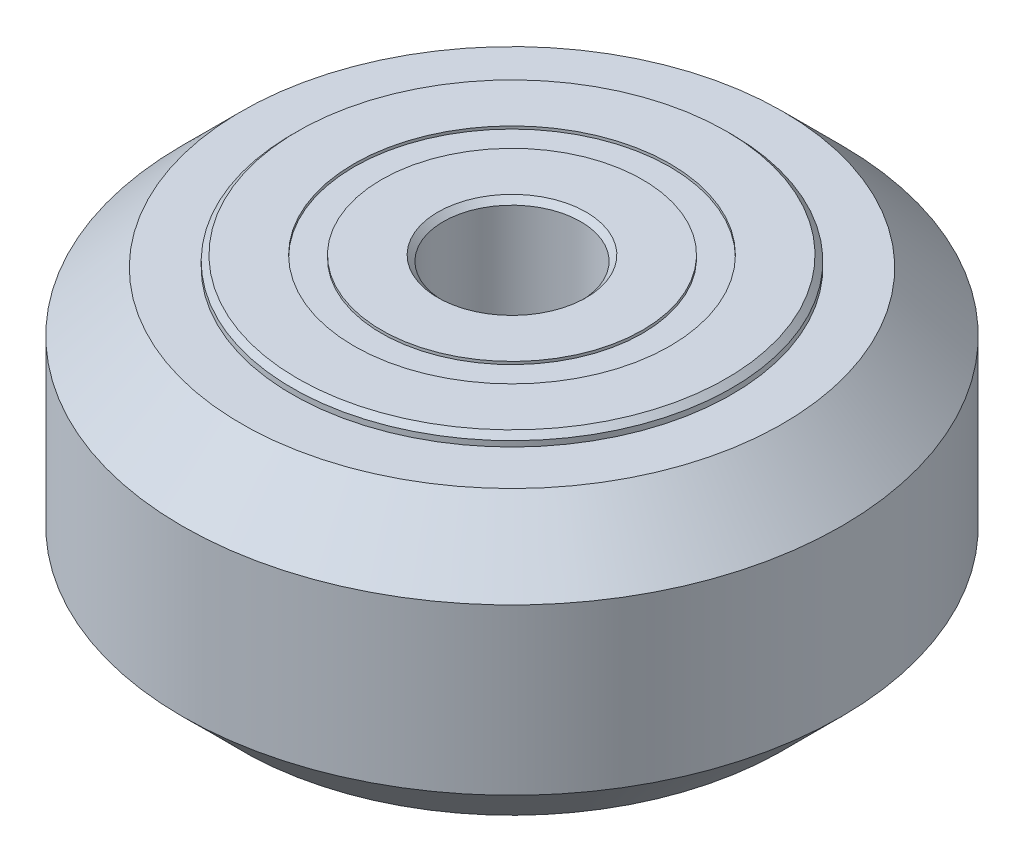
ISO-10303-21;
HEADER;
FILE_DESCRIPTION(('STEP AP214'),'2;1');
FILE_NAME('part.step','',(''),(''),'','','');
FILE_SCHEMA(('AUTOMOTIVE_DESIGN { 1 0 10303 214 1 1 1 1 }'));
ENDSEC;
DATA;
#1=APPLICATION_CONTEXT('core data for automotive mechanical design processes');
#2=APPLICATION_PROTOCOL_DEFINITION('international standard','automotive_design',2000,#1);
#3=PRODUCT_CONTEXT('',#1,'mechanical');
#4=PRODUCT('Part','Part','',(#3));
#5=PRODUCT_RELATED_PRODUCT_CATEGORY('part','',(#4));
#6=PRODUCT_DEFINITION_FORMATION('','',#4);
#7=PRODUCT_DEFINITION_CONTEXT('part definition',#1,'design');
#8=PRODUCT_DEFINITION('design','',#6,#7);
#9=PRODUCT_DEFINITION_SHAPE('','',#8);
#10=(LENGTH_UNIT() NAMED_UNIT(*) SI_UNIT(.MILLI.,.METRE.));
#11=(NAMED_UNIT(*) PLANE_ANGLE_UNIT() SI_UNIT($,.RADIAN.));
#12=(NAMED_UNIT(*) SI_UNIT($,.STERADIAN.) SOLID_ANGLE_UNIT());
#13=UNCERTAINTY_MEASURE_WITH_UNIT(LENGTH_MEASURE(1.E-05),#10,'distance_accuracy_value','');
#14=(GEOMETRIC_REPRESENTATION_CONTEXT(3) GLOBAL_UNCERTAINTY_ASSIGNED_CONTEXT((#13)) GLOBAL_UNIT_ASSIGNED_CONTEXT((#10,
#11,#12)) REPRESENTATION_CONTEXT('',''));
#15=CARTESIAN_POINT('',(0.,0.,0.));
#16=DIRECTION('',(0.,0.,1.));
#17=DIRECTION('',(1.,0.,0.));
#18=AXIS2_PLACEMENT_3D('',#15,#16,#17);
#19=CARTESIAN_POINT('',(0.,-0.2,0.));
#20=DIRECTION('',(0.,-1.,0.));
#21=DIRECTION('',(0.,0.,-1.));
#22=AXIS2_PLACEMENT_3D('',#19,#20,#21);
#23=CONICAL_SURFACE('',#22,2.5,0.7853981625);
#24=CARTESIAN_POINT('',(0.,-0.2,0.));
#25=DIRECTION('',(0.,-1.,0.));
#26=DIRECTION('',(0.,0.,-1.));
#27=AXIS2_PLACEMENT_3D('',#24,#25,#26);
#28=CIRCLE('',#27,2.5);
#29=CARTESIAN_POINT('',(0.,-0.2,-2.5));
#30=VERTEX_POINT('',#29);
#31=EDGE_CURVE('P0_E90',#30,#30,#28,.T.);
#32=ORIENTED_EDGE('',*,*,#31,.F.);
#33=EDGE_LOOP('',(#32));
#34=FACE_BOUND('',#33,.T.);
#35=CARTESIAN_POINT('',(0.,-0.4,0.));
#36=DIRECTION('',(0.,1.,0.));
#37=DIRECTION('',(0.,0.,-1.));
#38=AXIS2_PLACEMENT_3D('',#35,#36,#37);
#39=CIRCLE('',#38,2.7);
#40=CARTESIAN_POINT('',(0.,-0.4,-2.7));
#41=VERTEX_POINT('',#40);
#42=EDGE_CURVE('P0_E130',#41,#41,#39,.T.);
#43=ORIENTED_EDGE('',*,*,#42,.F.);
#44=EDGE_LOOP('',(#43));
#45=FACE_BOUND('',#44,.T.);
#46=ADVANCED_FACE('P0_F16',(#34,#45),#23,.F.);
#47=CARTESIAN_POINT('',(0.,4.6,0.));
#48=DIRECTION('',(0.,1.,0.));
#49=DIRECTION('',(0.,0.,1.));
#50=AXIS2_PLACEMENT_3D('',#47,#48,#49);
#51=CONICAL_SURFACE('',#50,2.7,0.785398162500002);
#52=CARTESIAN_POINT('',(0.,4.6,0.));
#53=DIRECTION('',(0.,-1.,0.));
#54=DIRECTION('',(0.,0.,-1.));
#55=AXIS2_PLACEMENT_3D('',#52,#53,#54);
#56=CIRCLE('',#55,2.7);
#57=CARTESIAN_POINT('',(0.,4.6,-2.7));
#58=VERTEX_POINT('',#57);
#59=EDGE_CURVE('P0_E111',#58,#58,#56,.T.);
#60=ORIENTED_EDGE('',*,*,#59,.F.);
#61=EDGE_LOOP('',(#60));
#62=FACE_BOUND('',#61,.T.);
#63=CARTESIAN_POINT('',(0.,4.4,0.));
#64=DIRECTION('',(0.,1.,0.));
#65=DIRECTION('',(0.,0.,-1.));
#66=AXIS2_PLACEMENT_3D('',#63,#64,#65);
#67=CIRCLE('',#66,2.5);
#68=CARTESIAN_POINT('',(0.,4.4,-2.5));
#69=VERTEX_POINT('',#68);
#70=EDGE_CURVE('P0_E99',#69,#69,#67,.T.);
#71=ORIENTED_EDGE('',*,*,#70,.F.);
#72=EDGE_LOOP('',(#71));
#73=FACE_BOUND('',#72,.T.);
#74=ADVANCED_FACE('P0_F240',(#62,#73),#51,.F.);
#75=CARTESIAN_POINT('',(0.,-0.4,0.));
#76=DIRECTION('',(0.,1.,0.));
#77=DIRECTION('',(0.,0.,1.));
#78=AXIS2_PLACEMENT_3D('',#75,#76,#77);
#79=CONICAL_SURFACE('',#78,7.8,0.7853981625);
#80=CARTESIAN_POINT('',(0.,-0.4,0.));
#81=DIRECTION('',(0.,-1.,0.));
#82=DIRECTION('',(0.,0.,-1.));
#83=AXIS2_PLACEMENT_3D('',#80,#81,#82);
#84=CIRCLE('',#83,7.8);
#85=CARTESIAN_POINT('',(0.,-0.4,-7.8));
#86=VERTEX_POINT('',#85);
#87=EDGE_CURVE('P0_E147',#86,#86,#84,.T.);
#88=ORIENTED_EDGE('',*,*,#87,.F.);
#89=EDGE_LOOP('',(#88));
#90=FACE_BOUND('',#89,.T.);
#91=CARTESIAN_POINT('',(0.,-0.2,0.));
#92=DIRECTION('',(0.,1.,0.));
#93=DIRECTION('',(0.,0.,-1.));
#94=AXIS2_PLACEMENT_3D('',#91,#92,#93);
#95=CIRCLE('',#94,8.);
#96=CARTESIAN_POINT('',(0.,-0.2,-8.));
#97=VERTEX_POINT('',#96);
#98=EDGE_CURVE('P0_E139',#97,#97,#95,.T.);
#99=ORIENTED_EDGE('',*,*,#98,.F.);
#100=EDGE_LOOP('',(#99));
#101=FACE_BOUND('',#100,.T.);
#102=ADVANCED_FACE('P0_F210',(#90,#101),#79,.T.);
#103=CARTESIAN_POINT('',(0.,4.4,0.));
#104=DIRECTION('',(0.,-1.,0.));
#105=DIRECTION('',(0.,0.,-1.));
#106=AXIS2_PLACEMENT_3D('',#103,#104,#105);
#107=CONICAL_SURFACE('',#106,8.,0.7853981625);
#108=CARTESIAN_POINT('',(0.,4.4,0.));
#109=DIRECTION('',(0.,-1.,0.));
#110=DIRECTION('',(0.,0.,-1.));
#111=AXIS2_PLACEMENT_3D('',#108,#109,#110);
#112=CIRCLE('',#111,8.);
#113=CARTESIAN_POINT('',(0.,4.4,-8.));
#114=VERTEX_POINT('',#113);
#115=EDGE_CURVE('P0_E122',#114,#114,#112,.T.);
#116=ORIENTED_EDGE('',*,*,#115,.F.);
#117=EDGE_LOOP('',(#116));
#118=FACE_BOUND('',#117,.T.);
#119=CARTESIAN_POINT('',(0.,4.6,0.));
#120=DIRECTION('',(0.,1.,0.));
#121=DIRECTION('',(0.,0.,-1.));
#122=AXIS2_PLACEMENT_3D('',#119,#120,#121);
#123=CIRCLE('',#122,7.8);
#124=CARTESIAN_POINT('',(0.,4.6,-7.8));
#125=VERTEX_POINT('',#124);
#126=EDGE_CURVE('P0_E124',#125,#125,#123,.T.);
#127=ORIENTED_EDGE('',*,*,#126,.F.);
#128=EDGE_LOOP('',(#127));
#129=FACE_BOUND('',#128,.T.);
#130=ADVANCED_FACE('P0_F204',(#118,#129),#107,.T.);
#131=CARTESIAN_POINT('',(0.,-0.3,0.));
#132=DIRECTION('',(0.,-1.,0.));
#133=DIRECTION('',(0.,0.,-1.));
#134=AXIS2_PLACEMENT_3D('',#131,#132,#133);
#135=PLANE('',#134);
#136=CARTESIAN_POINT('',(0.,-0.3,0.));
#137=DIRECTION('',(0.,-1.,0.));
#138=DIRECTION('',(1.,0.,0.));
#139=AXIS2_PLACEMENT_3D('',#136,#137,#138);
#140=CIRCLE('',#139,4.75);
#141=CARTESIAN_POINT('',(4.75,-0.3,0.));
#142=VERTEX_POINT('',#141);
#143=EDGE_CURVE('P0_E11',#142,#142,#140,.T.);
#144=ORIENTED_EDGE('',*,*,#143,.F.);
#145=EDGE_LOOP('',(#144));
#146=FACE_BOUND('',#145,.T.);
#147=CARTESIAN_POINT('',(0.,-0.3,0.));
#148=DIRECTION('',(0.,1.,0.));
#149=DIRECTION('',(1.,0.,0.));
#150=AXIS2_PLACEMENT_3D('',#147,#148,#149);
#151=CIRCLE('',#150,5.75);
#152=CARTESIAN_POINT('',(5.75,-0.3,0.));
#153=VERTEX_POINT('',#152);
#154=EDGE_CURVE('P0_E20',#153,#153,#151,.T.);
#155=ORIENTED_EDGE('',*,*,#154,.F.);
#156=EDGE_LOOP('',(#155));
#157=FACE_BOUND('',#156,.T.);
#158=ADVANCED_FACE('P0_F209',(#146,#157),#135,.T.);
#159=CARTESIAN_POINT('',(0.,-0.3,0.));
#160=DIRECTION('',(0.,-1.,0.));
#161=DIRECTION('',(0.,0.,-1.));
#162=AXIS2_PLACEMENT_3D('',#159,#160,#161);
#163=CYLINDRICAL_SURFACE('',#162,4.75);
#164=CARTESIAN_POINT('',(0.,-0.4,0.));
#165=DIRECTION('',(0.,1.,0.));
#166=DIRECTION('',(1.,0.,0.));
#167=AXIS2_PLACEMENT_3D('',#164,#165,#166);
#168=CIRCLE('',#167,4.75);
#169=CARTESIAN_POINT('',(4.75,-0.4,0.));
#170=VERTEX_POINT('',#169);
#171=EDGE_CURVE('P0_E133',#170,#170,#168,.T.);
#172=ORIENTED_EDGE('',*,*,#171,.T.);
#173=EDGE_LOOP('',(#172));
#174=FACE_BOUND('',#173,.T.);
#175=ORIENTED_EDGE('',*,*,#143,.T.);
#176=EDGE_LOOP('',(#175));
#177=FACE_BOUND('',#176,.T.);
#178=ADVANCED_FACE('P0_F249',(#174,#177),#163,.T.);
#179=CARTESIAN_POINT('',(0.,-0.3,0.));
#180=DIRECTION('',(0.,-1.,0.));
#181=DIRECTION('',(0.,0.,-1.));
#182=AXIS2_PLACEMENT_3D('',#179,#180,#181);
#183=CYLINDRICAL_SURFACE('',#182,5.75);
#184=CARTESIAN_POINT('',(0.,-0.4,0.));
#185=DIRECTION('',(0.,-1.,0.));
#186=DIRECTION('',(1.,0.,0.));
#187=AXIS2_PLACEMENT_3D('',#184,#185,#186);
#188=CIRCLE('',#187,5.75);
#189=CARTESIAN_POINT('',(5.75,-0.4,0.));
#190=VERTEX_POINT('',#189);
#191=EDGE_CURVE('P0_E134',#190,#190,#188,.T.);
#192=ORIENTED_EDGE('',*,*,#191,.T.);
#193=EDGE_LOOP('',(#192));
#194=FACE_BOUND('',#193,.T.);
#195=ORIENTED_EDGE('',*,*,#154,.T.);
#196=EDGE_LOOP('',(#195));
#197=FACE_BOUND('',#196,.T.);
#198=ADVANCED_FACE('P0_F222',(#194,#197),#183,.F.);
#199=CARTESIAN_POINT('',(0.,4.5,0.));
#200=DIRECTION('',(0.,-1.,0.));
#201=DIRECTION('',(0.,0.,-1.));
#202=AXIS2_PLACEMENT_3D('',#199,#200,#201);
#203=PLANE('',#202);
#204=CARTESIAN_POINT('',(0.,4.5,0.));
#205=DIRECTION('',(0.,-1.,0.));
#206=DIRECTION('',(1.,0.,0.));
#207=AXIS2_PLACEMENT_3D('',#204,#205,#206);
#208=CIRCLE('',#207,4.75);
#209=CARTESIAN_POINT('',(4.75,4.5,0.));
#210=VERTEX_POINT('',#209);
#211=EDGE_CURVE('P0_E129',#210,#210,#208,.T.);
#212=ORIENTED_EDGE('',*,*,#211,.T.);
#213=EDGE_LOOP('',(#212));
#214=FACE_BOUND('',#213,.T.);
#215=CARTESIAN_POINT('',(0.,4.5,0.));
#216=DIRECTION('',(0.,1.,0.));
#217=DIRECTION('',(1.,0.,0.));
#218=AXIS2_PLACEMENT_3D('',#215,#216,#217);
#219=CIRCLE('',#218,5.75);
#220=CARTESIAN_POINT('',(5.75,4.5,0.));
#221=VERTEX_POINT('',#220);
#222=EDGE_CURVE('P0_E84',#221,#221,#219,.T.);
#223=ORIENTED_EDGE('',*,*,#222,.T.);
#224=EDGE_LOOP('',(#223));
#225=FACE_BOUND('',#224,.T.);
#226=ADVANCED_FACE('P0_F217',(#214,#225),#203,.F.);
#227=CARTESIAN_POINT('',(0.,4.5,0.));
#228=DIRECTION('',(0.,1.,0.));
#229=DIRECTION('',(0.,0.,1.));
#230=AXIS2_PLACEMENT_3D('',#227,#228,#229);
#231=CYLINDRICAL_SURFACE('',#230,4.75);
#232=CARTESIAN_POINT('',(0.,4.6,0.));
#233=DIRECTION('',(0.,1.,0.));
#234=DIRECTION('',(1.,0.,0.));
#235=AXIS2_PLACEMENT_3D('',#232,#233,#234);
#236=CIRCLE('',#235,4.75);
#237=CARTESIAN_POINT('',(4.75,4.6,0.));
#238=VERTEX_POINT('',#237);
#239=EDGE_CURVE('P0_E105',#238,#238,#236,.T.);
#240=ORIENTED_EDGE('',*,*,#239,.F.);
#241=EDGE_LOOP('',(#240));
#242=FACE_BOUND('',#241,.T.);
#243=ORIENTED_EDGE('',*,*,#211,.F.);
#244=EDGE_LOOP('',(#243));
#245=FACE_BOUND('',#244,.T.);
#246=ADVANCED_FACE('P0_F221',(#242,#245),#231,.T.);
#247=CARTESIAN_POINT('',(0.,4.5,0.));
#248=DIRECTION('',(0.,1.,0.));
#249=DIRECTION('',(0.,0.,1.));
#250=AXIS2_PLACEMENT_3D('',#247,#248,#249);
#251=CYLINDRICAL_SURFACE('',#250,5.75);
#252=CARTESIAN_POINT('',(0.,4.6,0.));
#253=DIRECTION('',(0.,-1.,0.));
#254=DIRECTION('',(1.,0.,0.));
#255=AXIS2_PLACEMENT_3D('',#252,#253,#254);
#256=CIRCLE('',#255,5.75);
#257=CARTESIAN_POINT('',(5.75,4.6,0.));
#258=VERTEX_POINT('',#257);
#259=EDGE_CURVE('P0_E115',#258,#258,#256,.T.);
#260=ORIENTED_EDGE('',*,*,#259,.F.);
#261=EDGE_LOOP('',(#260));
#262=FACE_BOUND('',#261,.T.);
#263=ORIENTED_EDGE('',*,*,#222,.F.);
#264=EDGE_LOOP('',(#263));
#265=FACE_BOUND('',#264,.T.);
#266=ADVANCED_FACE('P0_F231',(#262,#265),#251,.F.);
#267=CARTESIAN_POINT('',(0.,-0.4,0.));
#268=DIRECTION('',(0.,1.,0.));
#269=DIRECTION('',(0.,0.,1.));
#270=AXIS2_PLACEMENT_3D('',#267,#268,#269);
#271=CYLINDRICAL_SURFACE('',#270,2.5);
#272=ORIENTED_EDGE('',*,*,#31,.T.);
#273=EDGE_LOOP('',(#272));
#274=FACE_BOUND('',#273,.T.);
#275=ORIENTED_EDGE('',*,*,#70,.T.);
#276=EDGE_LOOP('',(#275));
#277=FACE_BOUND('',#276,.T.);
#278=ADVANCED_FACE('P0_F258',(#274,#277),#271,.F.);
#279=CARTESIAN_POINT('',(0.,-0.4,0.));
#280=DIRECTION('',(0.,1.,0.));
#281=DIRECTION('',(0.,0.,1.));
#282=AXIS2_PLACEMENT_3D('',#279,#280,#281);
#283=CYLINDRICAL_SURFACE('',#282,8.);
#284=ORIENTED_EDGE('',*,*,#98,.T.);
#285=EDGE_LOOP('',(#284));
#286=FACE_BOUND('',#285,.T.);
#287=ORIENTED_EDGE('',*,*,#115,.T.);
#288=EDGE_LOOP('',(#287));
#289=FACE_BOUND('',#288,.T.);
#290=ADVANCED_FACE('P0_F290',(#286,#289),#283,.T.);
#291=CARTESIAN_POINT('',(0.,4.6,0.));
#292=DIRECTION('',(0.,-1.,0.));
#293=DIRECTION('',(0.,0.,-1.));
#294=AXIS2_PLACEMENT_3D('',#291,#292,#293);
#295=PLANE('',#294);
#296=ORIENTED_EDGE('',*,*,#239,.T.);
#297=EDGE_LOOP('',(#296));
#298=FACE_BOUND('',#297,.T.);
#299=ORIENTED_EDGE('',*,*,#59,.T.);
#300=EDGE_LOOP('',(#299));
#301=FACE_BOUND('',#300,.T.);
#302=ADVANCED_FACE('P0_F112',(#298,#301),#295,.F.);
#303=CARTESIAN_POINT('',(0.,4.6,0.));
#304=DIRECTION('',(0.,-1.,0.));
#305=DIRECTION('',(0.,0.,-1.));
#306=AXIS2_PLACEMENT_3D('',#303,#304,#305);
#307=PLANE('',#306);
#308=ORIENTED_EDGE('',*,*,#259,.T.);
#309=EDGE_LOOP('',(#308));
#310=FACE_BOUND('',#309,.T.);
#311=ORIENTED_EDGE('',*,*,#126,.T.);
#312=EDGE_LOOP('',(#311));
#313=FACE_BOUND('',#312,.T.);
#314=ADVANCED_FACE('P0_F298',(#310,#313),#307,.F.);
#315=CARTESIAN_POINT('',(0.,-0.4,0.));
#316=DIRECTION('',(0.,-1.,0.));
#317=DIRECTION('',(0.,0.,-1.));
#318=AXIS2_PLACEMENT_3D('',#315,#316,#317);
#319=PLANE('',#318);
#320=ORIENTED_EDGE('',*,*,#171,.F.);
#321=EDGE_LOOP('',(#320));
#322=FACE_BOUND('',#321,.T.);
#323=ORIENTED_EDGE('',*,*,#42,.T.);
#324=EDGE_LOOP('',(#323));
#325=FACE_BOUND('',#324,.T.);
#326=ADVANCED_FACE('P0_F18',(#322,#325),#319,.T.);
#327=CARTESIAN_POINT('',(0.,-0.4,0.));
#328=DIRECTION('',(0.,-1.,0.));
#329=DIRECTION('',(0.,0.,-1.));
#330=AXIS2_PLACEMENT_3D('',#327,#328,#329);
#331=PLANE('',#330);
#332=ORIENTED_EDGE('',*,*,#191,.F.);
#333=EDGE_LOOP('',(#332));
#334=FACE_BOUND('',#333,.T.);
#335=ORIENTED_EDGE('',*,*,#87,.T.);
#336=EDGE_LOOP('',(#335));
#337=FACE_BOUND('',#336,.T.);
#338=ADVANCED_FACE('P0_F319',(#334,#337),#331,.T.);
#339=CLOSED_SHELL('',(#46,#74,#102,#130,#158,#178,#198,#226,#246,#266,#278,#290,#302,#314,#326,#338));
#340=MANIFOLD_SOLID_BREP('P0_B1',#339);
#341=CARTESIAN_POINT('',(8.,5.7,0.));
#342=DIRECTION('',(0.,1.,0.));
#343=DIRECTION('',(1.,0.,0.));
#344=AXIS2_PLACEMENT_3D('',#341,#342,#343);
#345=PLANE('',#344);
#346=CARTESIAN_POINT('',(0.,5.7,0.));
#347=DIRECTION('',(0.,-1.,0.));
#348=DIRECTION('',(0.,0.,-1.));
#349=AXIS2_PLACEMENT_3D('',#346,#347,#348);
#350=CIRCLE('',#349,8.);
#351=CARTESIAN_POINT('',(0.,5.7,-8.));
#352=VERTEX_POINT('',#351);
#353=EDGE_CURVE('P1_E11',#352,#352,#350,.T.);
#354=ORIENTED_EDGE('',*,*,#353,.F.);
#355=EDGE_LOOP('',(#354));
#356=FACE_BOUND('',#355,.T.);
#357=CARTESIAN_POINT('',(0.,5.7,0.));
#358=DIRECTION('',(0.,-1.,0.));
#359=DIRECTION('',(0.,0.,-1.));
#360=AXIS2_PLACEMENT_3D('',#357,#358,#359);
#361=CIRCLE('',#360,7.25);
#362=CARTESIAN_POINT('',(0.,5.7,-7.25));
#363=VERTEX_POINT('',#362);
#364=EDGE_CURVE('P1_E71',#363,#363,#361,.T.);
#365=ORIENTED_EDGE('',*,*,#364,.T.);
#366=EDGE_LOOP('',(#365));
#367=FACE_BOUND('',#366,.T.);
#368=ADVANCED_FACE('P1_F16',(#356,#367),#345,.T.);
#369=CARTESIAN_POINT('',(0.,0.,0.));
#370=DIRECTION('',(0.,-1.,0.));
#371=DIRECTION('',(0.,0.,-1.));
#372=AXIS2_PLACEMENT_3D('',#369,#370,#371);
#373=CYLINDRICAL_SURFACE('',#372,8.);
#374=CARTESIAN_POINT('',(0.,10.3,0.));
#375=DIRECTION('',(0.,-1.,0.));
#376=DIRECTION('',(0.,0.,-1.));
#377=AXIS2_PLACEMENT_3D('',#374,#375,#376);
#378=CIRCLE('',#377,8.);
#379=CARTESIAN_POINT('',(0.,10.3,-8.));
#380=VERTEX_POINT('',#379);
#381=EDGE_CURVE('P1_E27',#380,#380,#378,.T.);
#382=ORIENTED_EDGE('',*,*,#381,.F.);
#383=EDGE_LOOP('',(#382));
#384=FACE_BOUND('',#383,.T.);
#385=ORIENTED_EDGE('',*,*,#353,.T.);
#386=EDGE_LOOP('',(#385));
#387=FACE_BOUND('',#386,.T.);
#388=ADVANCED_FACE('P1_F18',(#384,#387),#373,.F.);
#389=CARTESIAN_POINT('',(9.85,10.3,0.));
#390=DIRECTION('',(0.,1.,0.));
#391=DIRECTION('',(1.,0.,0.));
#392=AXIS2_PLACEMENT_3D('',#389,#390,#391);
#393=PLANE('',#392);
#394=CARTESIAN_POINT('',(0.,10.3,0.));
#395=DIRECTION('',(0.,-1.,0.));
#396=DIRECTION('',(0.,0.,-1.));
#397=AXIS2_PLACEMENT_3D('',#394,#395,#396);
#398=CIRCLE('',#397,9.85);
#399=CARTESIAN_POINT('',(0.,10.3,-9.85));
#400=VERTEX_POINT('',#399);
#401=EDGE_CURVE('P1_E95',#400,#400,#398,.T.);
#402=ORIENTED_EDGE('',*,*,#401,.F.);
#403=EDGE_LOOP('',(#402));
#404=FACE_BOUND('',#403,.T.);
#405=ORIENTED_EDGE('',*,*,#381,.T.);
#406=EDGE_LOOP('',(#405));
#407=FACE_BOUND('',#406,.T.);
#408=ADVANCED_FACE('P1_F138',(#404,#407),#393,.T.);
#409=CARTESIAN_POINT('',(0.,8.15,0.));
#410=DIRECTION('',(0.,-1.,0.));
#411=DIRECTION('',(0.,0.,-1.));
#412=AXIS2_PLACEMENT_3D('',#409,#410,#411);
#413=CONICAL_SURFACE('',#412,12.,0.7853981625);
#414=CARTESIAN_POINT('',(0.,8.15,0.));
#415=DIRECTION('',(0.,-1.,0.));
#416=DIRECTION('',(0.,0.,-1.));
#417=AXIS2_PLACEMENT_3D('',#414,#415,#416);
#418=CIRCLE('',#417,12.);
#419=CARTESIAN_POINT('',(0.,8.15,-12.));
#420=VERTEX_POINT('',#419);
#421=EDGE_CURVE('P1_E93',#420,#420,#418,.T.);
#422=ORIENTED_EDGE('',*,*,#421,.F.);
#423=EDGE_LOOP('',(#422));
#424=FACE_BOUND('',#423,.T.);
#425=ORIENTED_EDGE('',*,*,#401,.T.);
#426=EDGE_LOOP('',(#425));
#427=FACE_BOUND('',#426,.T.);
#428=ADVANCED_FACE('P1_F128',(#424,#427),#413,.T.);
#429=CARTESIAN_POINT('',(0.,0.,0.));
#430=DIRECTION('',(0.,-1.,0.));
#431=DIRECTION('',(0.,0.,-1.));
#432=AXIS2_PLACEMENT_3D('',#429,#430,#431);
#433=CYLINDRICAL_SURFACE('',#432,12.);
#434=CARTESIAN_POINT('',(0.,2.15,0.));
#435=DIRECTION('',(0.,-1.,0.));
#436=DIRECTION('',(0.,0.,-1.));
#437=AXIS2_PLACEMENT_3D('',#434,#435,#436);
#438=CIRCLE('',#437,12.);
#439=CARTESIAN_POINT('',(0.,2.15,-12.));
#440=VERTEX_POINT('',#439);
#441=EDGE_CURVE('P1_E96',#440,#440,#438,.T.);
#442=ORIENTED_EDGE('',*,*,#441,.F.);
#443=EDGE_LOOP('',(#442));
#444=FACE_BOUND('',#443,.T.);
#445=ORIENTED_EDGE('',*,*,#421,.T.);
#446=EDGE_LOOP('',(#445));
#447=FACE_BOUND('',#446,.T.);
#448=ADVANCED_FACE('P1_F118',(#444,#447),#433,.T.);
#449=CARTESIAN_POINT('',(0.,0.,0.));
#450=DIRECTION('',(0.,1.,0.));
#451=DIRECTION('',(0.,0.,1.));
#452=AXIS2_PLACEMENT_3D('',#449,#450,#451);
#453=CONICAL_SURFACE('',#452,9.85,0.785398162500003);
#454=CARTESIAN_POINT('',(0.,0.,0.));
#455=DIRECTION('',(0.,-1.,0.));
#456=DIRECTION('',(0.,0.,-1.));
#457=AXIS2_PLACEMENT_3D('',#454,#455,#456);
#458=CIRCLE('',#457,9.85);
#459=CARTESIAN_POINT('',(0.,0.,-9.85));
#460=VERTEX_POINT('',#459);
#461=EDGE_CURVE('P1_E88',#460,#460,#458,.T.);
#462=ORIENTED_EDGE('',*,*,#461,.F.);
#463=EDGE_LOOP('',(#462));
#464=FACE_BOUND('',#463,.T.);
#465=ORIENTED_EDGE('',*,*,#441,.T.);
#466=EDGE_LOOP('',(#465));
#467=FACE_BOUND('',#466,.T.);
#468=ADVANCED_FACE('P1_F116',(#464,#467),#453,.T.);
#469=CARTESIAN_POINT('',(8.,0.,0.));
#470=DIRECTION('',(0.,-1.,0.));
#471=DIRECTION('',(0.,0.,-1.));
#472=AXIS2_PLACEMENT_3D('',#469,#470,#471);
#473=PLANE('',#472);
#474=CARTESIAN_POINT('',(0.,0.,0.));
#475=DIRECTION('',(0.,-1.,0.));
#476=DIRECTION('',(0.,0.,-1.));
#477=AXIS2_PLACEMENT_3D('',#474,#475,#476);
#478=CIRCLE('',#477,8.);
#479=CARTESIAN_POINT('',(0.,0.,-8.));
#480=VERTEX_POINT('',#479);
#481=EDGE_CURVE('P1_E81',#480,#480,#478,.T.);
#482=ORIENTED_EDGE('',*,*,#481,.F.);
#483=EDGE_LOOP('',(#482));
#484=FACE_BOUND('',#483,.T.);
#485=ORIENTED_EDGE('',*,*,#461,.T.);
#486=EDGE_LOOP('',(#485));
#487=FACE_BOUND('',#486,.T.);
#488=ADVANCED_FACE('P1_F114',(#484,#487),#473,.T.);
#489=CARTESIAN_POINT('',(0.,0.,0.));
#490=DIRECTION('',(0.,-1.,0.));
#491=DIRECTION('',(0.,0.,-1.));
#492=AXIS2_PLACEMENT_3D('',#489,#490,#491);
#493=CYLINDRICAL_SURFACE('',#492,8.);
#494=CARTESIAN_POINT('',(0.,4.6,0.));
#495=DIRECTION('',(0.,-1.,0.));
#496=DIRECTION('',(0.,0.,-1.));
#497=AXIS2_PLACEMENT_3D('',#494,#495,#496);
#498=CIRCLE('',#497,8.);
#499=CARTESIAN_POINT('',(0.,4.6,-8.));
#500=VERTEX_POINT('',#499);
#501=EDGE_CURVE('P1_E77',#500,#500,#498,.T.);
#502=ORIENTED_EDGE('',*,*,#501,.F.);
#503=EDGE_LOOP('',(#502));
#504=FACE_BOUND('',#503,.T.);
#505=ORIENTED_EDGE('',*,*,#481,.T.);
#506=EDGE_LOOP('',(#505));
#507=FACE_BOUND('',#506,.T.);
#508=ADVANCED_FACE('P1_F125',(#504,#507),#493,.F.);
#509=CARTESIAN_POINT('',(7.25,4.6,0.));
#510=DIRECTION('',(0.,-1.,0.));
#511=DIRECTION('',(0.,0.,-1.));
#512=AXIS2_PLACEMENT_3D('',#509,#510,#511);
#513=PLANE('',#512);
#514=CARTESIAN_POINT('',(0.,4.6,0.));
#515=DIRECTION('',(0.,-1.,0.));
#516=DIRECTION('',(0.,0.,-1.));
#517=AXIS2_PLACEMENT_3D('',#514,#515,#516);
#518=CIRCLE('',#517,7.25);
#519=CARTESIAN_POINT('',(0.,4.6,-7.25));
#520=VERTEX_POINT('',#519);
#521=EDGE_CURVE('P1_E20',#520,#520,#518,.T.);
#522=ORIENTED_EDGE('',*,*,#521,.F.);
#523=EDGE_LOOP('',(#522));
#524=FACE_BOUND('',#523,.T.);
#525=ORIENTED_EDGE('',*,*,#501,.T.);
#526=EDGE_LOOP('',(#525));
#527=FACE_BOUND('',#526,.T.);
#528=ADVANCED_FACE('P1_F78',(#524,#527),#513,.T.);
#529=CARTESIAN_POINT('',(0.,0.,0.));
#530=DIRECTION('',(0.,-1.,0.));
#531=DIRECTION('',(0.,0.,-1.));
#532=AXIS2_PLACEMENT_3D('',#529,#530,#531);
#533=CYLINDRICAL_SURFACE('',#532,7.25);
#534=ORIENTED_EDGE('',*,*,#364,.F.);
#535=EDGE_LOOP('',(#534));
#536=FACE_BOUND('',#535,.T.);
#537=ORIENTED_EDGE('',*,*,#521,.T.);
#538=EDGE_LOOP('',(#537));
#539=FACE_BOUND('',#538,.T.);
#540=ADVANCED_FACE('P1_F143',(#536,#539),#533,.F.);
#541=CLOSED_SHELL('',(#368,#388,#408,#428,#448,#468,#488,#508,#528,#540));
#542=MANIFOLD_SOLID_BREP('P1_B1',#541);
#543=CARTESIAN_POINT('',(0.,5.7,0.));
#544=DIRECTION('',(0.,1.,0.));
#545=DIRECTION('',(0.,0.,1.));
#546=AXIS2_PLACEMENT_3D('',#543,#544,#545);
#547=CONICAL_SURFACE('',#546,7.8,0.7853981625);
#548=CARTESIAN_POINT('',(0.,5.7,0.));
#549=DIRECTION('',(0.,-1.,0.));
#550=DIRECTION('',(0.,0.,-1.));
#551=AXIS2_PLACEMENT_3D('',#548,#549,#550);
#552=CIRCLE('',#551,7.8);
#553=CARTESIAN_POINT('',(0.,5.7,-7.8));
#554=VERTEX_POINT('',#553);
#555=EDGE_CURVE('P2_E136',#554,#554,#552,.T.);
#556=ORIENTED_EDGE('',*,*,#555,.F.);
#557=EDGE_LOOP('',(#556));
#558=FACE_BOUND('',#557,.T.);
#559=CARTESIAN_POINT('',(0.,5.9,0.));
#560=DIRECTION('',(0.,1.,0.));
#561=DIRECTION('',(0.,0.,-1.));
#562=AXIS2_PLACEMENT_3D('',#559,#560,#561);
#563=CIRCLE('',#562,8.);
#564=CARTESIAN_POINT('',(0.,5.9,-8.));
#565=VERTEX_POINT('',#564);
#566=EDGE_CURVE('P2_E129',#565,#565,#563,.T.);
#567=ORIENTED_EDGE('',*,*,#566,.F.);
#568=EDGE_LOOP('',(#567));
#569=FACE_BOUND('',#568,.T.);
#570=ADVANCED_FACE('P2_F16',(#558,#569),#547,.T.);
#571=CARTESIAN_POINT('',(0.,10.5,0.));
#572=DIRECTION('',(0.,-1.,0.));
#573=DIRECTION('',(0.,0.,-1.));
#574=AXIS2_PLACEMENT_3D('',#571,#572,#573);
#575=CONICAL_SURFACE('',#574,8.,0.785398162499998);
#576=CARTESIAN_POINT('',(0.,10.5,0.));
#577=DIRECTION('',(0.,-1.,0.));
#578=DIRECTION('',(0.,0.,-1.));
#579=AXIS2_PLACEMENT_3D('',#576,#577,#578);
#580=CIRCLE('',#579,8.);
#581=CARTESIAN_POINT('',(0.,10.5,-8.));
#582=VERTEX_POINT('',#581);
#583=EDGE_CURVE('P2_E125',#582,#582,#580,.T.);
#584=ORIENTED_EDGE('',*,*,#583,.F.);
#585=EDGE_LOOP('',(#584));
#586=FACE_BOUND('',#585,.T.);
#587=CARTESIAN_POINT('',(0.,10.7,0.));
#588=DIRECTION('',(0.,1.,0.));
#589=DIRECTION('',(0.,0.,-1.));
#590=AXIS2_PLACEMENT_3D('',#587,#588,#589);
#591=CIRCLE('',#590,7.8);
#592=CARTESIAN_POINT('',(0.,10.7,-7.8));
#593=VERTEX_POINT('',#592);
#594=EDGE_CURVE('P2_E72',#593,#593,#591,.T.);
#595=ORIENTED_EDGE('',*,*,#594,.F.);
#596=EDGE_LOOP('',(#595));
#597=FACE_BOUND('',#596,.T.);
#598=ADVANCED_FACE('P2_F180',(#586,#597),#575,.T.);
#599=CARTESIAN_POINT('',(0.,5.7,0.));
#600=DIRECTION('',(0.,-1.,0.));
#601=DIRECTION('',(0.,0.,-1.));
#602=AXIS2_PLACEMENT_3D('',#599,#600,#601);
#603=CONICAL_SURFACE('',#602,2.7,0.785398162500002);
#604=CARTESIAN_POINT('',(0.,5.7,0.));
#605=DIRECTION('',(0.,1.,0.));
#606=DIRECTION('',(0.,0.,-1.));
#607=AXIS2_PLACEMENT_3D('',#604,#605,#606);
#608=CIRCLE('',#607,2.7);
#609=CARTESIAN_POINT('',(0.,5.7,-2.7));
#610=VERTEX_POINT('',#609);
#611=EDGE_CURVE('P2_E131',#610,#610,#608,.T.);
#612=ORIENTED_EDGE('',*,*,#611,.F.);
#613=EDGE_LOOP('',(#612));
#614=FACE_BOUND('',#613,.T.);
#615=CARTESIAN_POINT('',(0.,5.9,0.));
#616=DIRECTION('',(0.,-1.,0.));
#617=DIRECTION('',(0.,0.,-1.));
#618=AXIS2_PLACEMENT_3D('',#615,#616,#617);
#619=CIRCLE('',#618,2.5);
#620=CARTESIAN_POINT('',(0.,5.9,-2.5));
#621=VERTEX_POINT('',#620);
#622=EDGE_CURVE('P2_E113',#621,#621,#619,.T.);
#623=ORIENTED_EDGE('',*,*,#622,.F.);
#624=EDGE_LOOP('',(#623));
#625=FACE_BOUND('',#624,.T.);
#626=ADVANCED_FACE('P2_F186',(#614,#625),#603,.F.);
#627=CARTESIAN_POINT('',(0.,10.5,0.));
#628=DIRECTION('',(0.,1.,0.));
#629=DIRECTION('',(0.,0.,1.));
#630=AXIS2_PLACEMENT_3D('',#627,#628,#629);
#631=CONICAL_SURFACE('',#630,2.5,0.7853981625);
#632=CARTESIAN_POINT('',(0.,10.5,0.));
#633=DIRECTION('',(0.,1.,0.));
#634=DIRECTION('',(0.,0.,-1.));
#635=AXIS2_PLACEMENT_3D('',#632,#633,#634);
#636=CIRCLE('',#635,2.5);
#637=CARTESIAN_POINT('',(0.,10.5,-2.5));
#638=VERTEX_POINT('',#637);
#639=EDGE_CURVE('P2_E120',#638,#638,#636,.T.);
#640=ORIENTED_EDGE('',*,*,#639,.F.);
#641=EDGE_LOOP('',(#640));
#642=FACE_BOUND('',#641,.T.);
#643=CARTESIAN_POINT('',(0.,10.7,0.));
#644=DIRECTION('',(0.,-1.,0.));
#645=DIRECTION('',(0.,0.,-1.));
#646=AXIS2_PLACEMENT_3D('',#643,#644,#645);
#647=CIRCLE('',#646,2.7);
#648=CARTESIAN_POINT('',(0.,10.7,-2.7));
#649=VERTEX_POINT('',#648);
#650=EDGE_CURVE('P2_E124',#649,#649,#647,.T.);
#651=ORIENTED_EDGE('',*,*,#650,.F.);
#652=EDGE_LOOP('',(#651));
#653=FACE_BOUND('',#652,.T.);
#654=ADVANCED_FACE('P2_F177',(#642,#653),#631,.F.);
#655=CARTESIAN_POINT('',(0.,10.6,0.));
#656=DIRECTION('',(0.,-1.,0.));
#657=DIRECTION('',(0.,0.,-1.));
#658=AXIS2_PLACEMENT_3D('',#655,#656,#657);
#659=PLANE('',#658);
#660=CARTESIAN_POINT('',(0.,10.6,0.));
#661=DIRECTION('',(0.,-1.,0.));
#662=DIRECTION('',(1.,0.,0.));
#663=AXIS2_PLACEMENT_3D('',#660,#661,#662);
#664=CIRCLE('',#663,4.75);
#665=CARTESIAN_POINT('',(4.75,10.6,0.));
#666=VERTEX_POINT('',#665);
#667=EDGE_CURVE('P2_E11',#666,#666,#664,.T.);
#668=ORIENTED_EDGE('',*,*,#667,.T.);
#669=EDGE_LOOP('',(#668));
#670=FACE_BOUND('',#669,.T.);
#671=CARTESIAN_POINT('',(0.,10.6,0.));
#672=DIRECTION('',(0.,1.,0.));
#673=DIRECTION('',(1.,0.,0.));
#674=AXIS2_PLACEMENT_3D('',#671,#672,#673);
#675=CIRCLE('',#674,5.75);
#676=CARTESIAN_POINT('',(5.75,10.6,0.));
#677=VERTEX_POINT('',#676);
#678=EDGE_CURVE('P2_E27',#677,#677,#675,.T.);
#679=ORIENTED_EDGE('',*,*,#678,.T.);
#680=EDGE_LOOP('',(#679));
#681=FACE_BOUND('',#680,.T.);
#682=ADVANCED_FACE('P2_F167',(#670,#681),#659,.F.);
#683=CARTESIAN_POINT('',(0.,10.6,0.));
#684=DIRECTION('',(0.,1.,0.));
#685=DIRECTION('',(0.,0.,1.));
#686=AXIS2_PLACEMENT_3D('',#683,#684,#685);
#687=CYLINDRICAL_SURFACE('',#686,4.75);
#688=CARTESIAN_POINT('',(0.,10.7,0.));
#689=DIRECTION('',(0.,1.,0.));
#690=DIRECTION('',(1.,0.,0.));
#691=AXIS2_PLACEMENT_3D('',#688,#689,#690);
#692=CIRCLE('',#691,4.75);
#693=CARTESIAN_POINT('',(4.75,10.7,0.));
#694=VERTEX_POINT('',#693);
#695=EDGE_CURVE('P2_E140',#694,#694,#692,.T.);
#696=ORIENTED_EDGE('',*,*,#695,.F.);
#697=EDGE_LOOP('',(#696));
#698=FACE_BOUND('',#697,.T.);
#699=ORIENTED_EDGE('',*,*,#667,.F.);
#700=EDGE_LOOP('',(#699));
#701=FACE_BOUND('',#700,.T.);
#702=ADVANCED_FACE('P2_F18',(#698,#701),#687,.T.);
#703=CARTESIAN_POINT('',(0.,10.6,0.));
#704=DIRECTION('',(0.,1.,0.));
#705=DIRECTION('',(0.,0.,1.));
#706=AXIS2_PLACEMENT_3D('',#703,#704,#705);
#707=CYLINDRICAL_SURFACE('',#706,5.75);
#708=CARTESIAN_POINT('',(0.,10.7,0.));
#709=DIRECTION('',(0.,-1.,0.));
#710=DIRECTION('',(1.,0.,0.));
#711=AXIS2_PLACEMENT_3D('',#708,#709,#710);
#712=CIRCLE('',#711,5.75);
#713=CARTESIAN_POINT('',(5.75,10.7,0.));
#714=VERTEX_POINT('',#713);
#715=EDGE_CURVE('P2_E82',#714,#714,#712,.T.);
#716=ORIENTED_EDGE('',*,*,#715,.F.);
#717=EDGE_LOOP('',(#716));
#718=FACE_BOUND('',#717,.T.);
#719=ORIENTED_EDGE('',*,*,#678,.F.);
#720=EDGE_LOOP('',(#719));
#721=FACE_BOUND('',#720,.T.);
#722=ADVANCED_FACE('P2_F166',(#718,#721),#707,.F.);
#723=CARTESIAN_POINT('',(0.,5.8,0.));
#724=DIRECTION('',(0.,-1.,0.));
#725=DIRECTION('',(0.,0.,-1.));
#726=AXIS2_PLACEMENT_3D('',#723,#724,#725);
#727=PLANE('',#726);
#728=CARTESIAN_POINT('',(0.,5.8,0.));
#729=DIRECTION('',(0.,-1.,0.));
#730=DIRECTION('',(1.,0.,0.));
#731=AXIS2_PLACEMENT_3D('',#728,#729,#730);
#732=CIRCLE('',#731,4.75);
#733=CARTESIAN_POINT('',(4.75,5.8,0.));
#734=VERTEX_POINT('',#733);
#735=EDGE_CURVE('P2_E20',#734,#734,#732,.T.);
#736=ORIENTED_EDGE('',*,*,#735,.F.);
#737=EDGE_LOOP('',(#736));
#738=FACE_BOUND('',#737,.T.);
#739=CARTESIAN_POINT('',(0.,5.8,0.));
#740=DIRECTION('',(0.,1.,0.));
#741=DIRECTION('',(1.,0.,0.));
#742=AXIS2_PLACEMENT_3D('',#739,#740,#741);
#743=CIRCLE('',#742,5.75);
#744=CARTESIAN_POINT('',(5.75,5.8,0.));
#745=VERTEX_POINT('',#744);
#746=EDGE_CURVE('P2_E106',#745,#745,#743,.T.);
#747=ORIENTED_EDGE('',*,*,#746,.F.);
#748=EDGE_LOOP('',(#747));
#749=FACE_BOUND('',#748,.T.);
#750=ADVANCED_FACE('P2_F173',(#738,#749),#727,.T.);
#751=CARTESIAN_POINT('',(0.,5.8,0.));
#752=DIRECTION('',(0.,-1.,0.));
#753=DIRECTION('',(0.,0.,-1.));
#754=AXIS2_PLACEMENT_3D('',#751,#752,#753);
#755=CYLINDRICAL_SURFACE('',#754,4.75);
#756=CARTESIAN_POINT('',(0.,5.7,0.));
#757=DIRECTION('',(0.,1.,0.));
#758=DIRECTION('',(1.,0.,0.));
#759=AXIS2_PLACEMENT_3D('',#756,#757,#758);
#760=CIRCLE('',#759,4.75);
#761=CARTESIAN_POINT('',(4.75,5.7,0.));
#762=VERTEX_POINT('',#761);
#763=EDGE_CURVE('P2_E130',#762,#762,#760,.T.);
#764=ORIENTED_EDGE('',*,*,#763,.T.);
#765=EDGE_LOOP('',(#764));
#766=FACE_BOUND('',#765,.T.);
#767=ORIENTED_EDGE('',*,*,#735,.T.);
#768=EDGE_LOOP('',(#767));
#769=FACE_BOUND('',#768,.T.);
#770=ADVANCED_FACE('P2_F103',(#766,#769),#755,.T.);
#771=CARTESIAN_POINT('',(0.,5.8,0.));
#772=DIRECTION('',(0.,-1.,0.));
#773=DIRECTION('',(0.,0.,-1.));
#774=AXIS2_PLACEMENT_3D('',#771,#772,#773);
#775=CYLINDRICAL_SURFACE('',#774,5.75);
#776=CARTESIAN_POINT('',(0.,5.7,0.));
#777=DIRECTION('',(0.,-1.,0.));
#778=DIRECTION('',(1.,0.,0.));
#779=AXIS2_PLACEMENT_3D('',#776,#777,#778);
#780=CIRCLE('',#779,5.75);
#781=CARTESIAN_POINT('',(5.75,5.7,0.));
#782=VERTEX_POINT('',#781);
#783=EDGE_CURVE('P2_E133',#782,#782,#780,.T.);
#784=ORIENTED_EDGE('',*,*,#783,.T.);
#785=EDGE_LOOP('',(#784));
#786=FACE_BOUND('',#785,.T.);
#787=ORIENTED_EDGE('',*,*,#746,.T.);
#788=EDGE_LOOP('',(#787));
#789=FACE_BOUND('',#788,.T.);
#790=ADVANCED_FACE('P2_F214',(#786,#789),#775,.F.);
#791=CARTESIAN_POINT('',(0.,10.7,0.));
#792=DIRECTION('',(0.,-1.,0.));
#793=DIRECTION('',(0.,0.,-1.));
#794=AXIS2_PLACEMENT_3D('',#791,#792,#793);
#795=CYLINDRICAL_SURFACE('',#794,2.5);
#796=ORIENTED_EDGE('',*,*,#622,.T.);
#797=EDGE_LOOP('',(#796));
#798=FACE_BOUND('',#797,.T.);
#799=ORIENTED_EDGE('',*,*,#639,.T.);
#800=EDGE_LOOP('',(#799));
#801=FACE_BOUND('',#800,.T.);
#802=ADVANCED_FACE('P2_F211',(#798,#801),#795,.F.);
#803=CARTESIAN_POINT('',(0.,10.7,0.));
#804=DIRECTION('',(0.,-1.,0.));
#805=DIRECTION('',(0.,0.,-1.));
#806=AXIS2_PLACEMENT_3D('',#803,#804,#805);
#807=CYLINDRICAL_SURFACE('',#806,8.);
#808=ORIENTED_EDGE('',*,*,#566,.T.);
#809=EDGE_LOOP('',(#808));
#810=FACE_BOUND('',#809,.T.);
#811=ORIENTED_EDGE('',*,*,#583,.T.);
#812=EDGE_LOOP('',(#811));
#813=FACE_BOUND('',#812,.T.);
#814=ADVANCED_FACE('P2_F208',(#810,#813),#807,.T.);
#815=CARTESIAN_POINT('',(0.,5.7,0.));
#816=DIRECTION('',(0.,-1.,0.));
#817=DIRECTION('',(0.,0.,-1.));
#818=AXIS2_PLACEMENT_3D('',#815,#816,#817);
#819=PLANE('',#818);
#820=ORIENTED_EDGE('',*,*,#763,.F.);
#821=EDGE_LOOP('',(#820));
#822=FACE_BOUND('',#821,.T.);
#823=ORIENTED_EDGE('',*,*,#611,.T.);
#824=EDGE_LOOP('',(#823));
#825=FACE_BOUND('',#824,.T.);
#826=ADVANCED_FACE('P2_F196',(#822,#825),#819,.T.);
#827=CARTESIAN_POINT('',(0.,5.7,0.));
#828=DIRECTION('',(0.,-1.,0.));
#829=DIRECTION('',(0.,0.,-1.));
#830=AXIS2_PLACEMENT_3D('',#827,#828,#829);
#831=PLANE('',#830);
#832=ORIENTED_EDGE('',*,*,#783,.F.);
#833=EDGE_LOOP('',(#832));
#834=FACE_BOUND('',#833,.T.);
#835=ORIENTED_EDGE('',*,*,#555,.T.);
#836=EDGE_LOOP('',(#835));
#837=FACE_BOUND('',#836,.T.);
#838=ADVANCED_FACE('P2_F193',(#834,#837),#831,.T.);
#839=CARTESIAN_POINT('',(0.,10.7,0.));
#840=DIRECTION('',(0.,-1.,0.));
#841=DIRECTION('',(0.,0.,-1.));
#842=AXIS2_PLACEMENT_3D('',#839,#840,#841);
#843=PLANE('',#842);
#844=ORIENTED_EDGE('',*,*,#695,.T.);
#845=EDGE_LOOP('',(#844));
#846=FACE_BOUND('',#845,.T.);
#847=ORIENTED_EDGE('',*,*,#650,.T.);
#848=EDGE_LOOP('',(#847));
#849=FACE_BOUND('',#848,.T.);
#850=ADVANCED_FACE('P2_F162',(#846,#849),#843,.F.);
#851=CARTESIAN_POINT('',(0.,10.7,0.));
#852=DIRECTION('',(0.,-1.,0.));
#853=DIRECTION('',(0.,0.,-1.));
#854=AXIS2_PLACEMENT_3D('',#851,#852,#853);
#855=PLANE('',#854);
#856=ORIENTED_EDGE('',*,*,#715,.T.);
#857=EDGE_LOOP('',(#856));
#858=FACE_BOUND('',#857,.T.);
#859=ORIENTED_EDGE('',*,*,#594,.T.);
#860=EDGE_LOOP('',(#859));
#861=FACE_BOUND('',#860,.T.);
#862=ADVANCED_FACE('P2_F200',(#858,#861),#855,.F.);
#863=CLOSED_SHELL('',(#570,#598,#626,#654,#682,#702,#722,#750,#770,#790,#802,#814,#826,#838,
#850,#862));
#864=MANIFOLD_SOLID_BREP('P2_B1',#863);
#865=ADVANCED_BREP_SHAPE_REPRESENTATION('',(#18,#340,#542,#864),#14);
#866=SHAPE_DEFINITION_REPRESENTATION(#9,#865);
ENDSEC;
END-ISO-10303-21;
